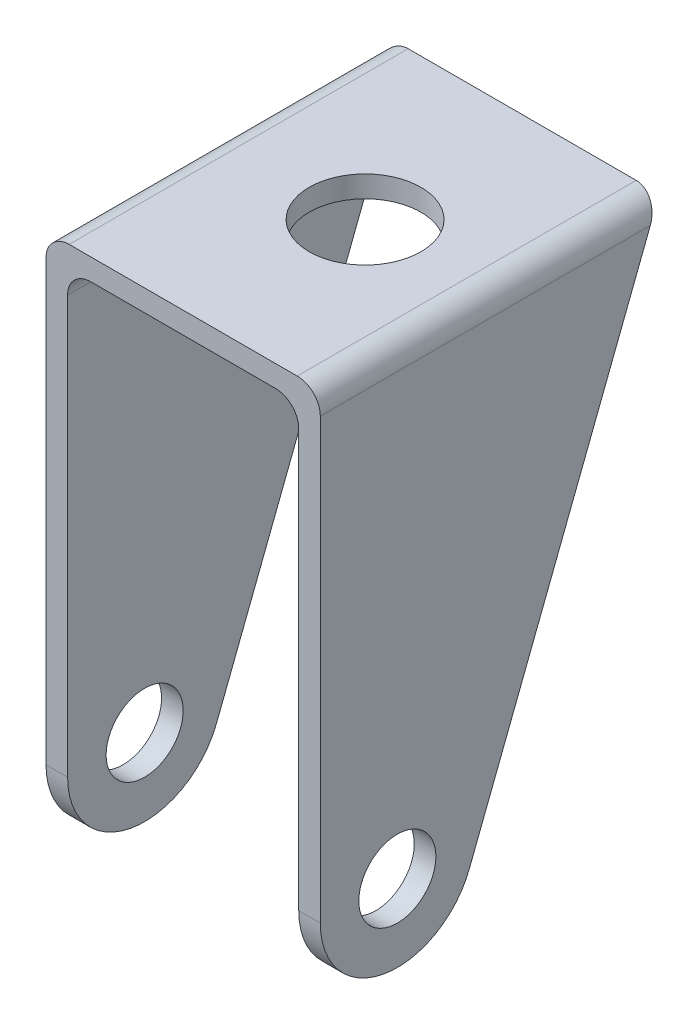
ISO-10303-21;
HEADER;
FILE_DESCRIPTION(('STEP AP214'),'2;1');
FILE_NAME('part.step','',(''),(''),'','','');
FILE_SCHEMA(('AUTOMOTIVE_DESIGN { 1 0 10303 214 1 1 1 1 }'));
ENDSEC;
DATA;
#1=APPLICATION_CONTEXT('core data for automotive mechanical design processes');
#2=APPLICATION_PROTOCOL_DEFINITION('international standard','automotive_design',2000,#1);
#3=PRODUCT_CONTEXT('',#1,'mechanical');
#4=PRODUCT('Part','Part','',(#3));
#5=PRODUCT_RELATED_PRODUCT_CATEGORY('part','',(#4));
#6=PRODUCT_DEFINITION_FORMATION('','',#4);
#7=PRODUCT_DEFINITION_CONTEXT('part definition',#1,'design');
#8=PRODUCT_DEFINITION('design','',#6,#7);
#9=PRODUCT_DEFINITION_SHAPE('','',#8);
#10=(LENGTH_UNIT() NAMED_UNIT(*) SI_UNIT(.MILLI.,.METRE.));
#11=(NAMED_UNIT(*) PLANE_ANGLE_UNIT() SI_UNIT($,.RADIAN.));
#12=(NAMED_UNIT(*) SI_UNIT($,.STERADIAN.) SOLID_ANGLE_UNIT());
#13=UNCERTAINTY_MEASURE_WITH_UNIT(LENGTH_MEASURE(1.E-05),#10,'distance_accuracy_value','');
#14=(GEOMETRIC_REPRESENTATION_CONTEXT(3) GLOBAL_UNCERTAINTY_ASSIGNED_CONTEXT((#13)) GLOBAL_UNIT_ASSIGNED_CONTEXT((#10,
#11,#12)) REPRESENTATION_CONTEXT('',''));
#15=CARTESIAN_POINT('',(0.,0.,0.));
#16=DIRECTION('',(0.,0.,1.));
#17=DIRECTION('',(1.,0.,0.));
#18=AXIS2_PLACEMENT_3D('',#15,#16,#17);
#19=CARTESIAN_POINT('',(30.,70.,44.));
#20=DIRECTION('',(1.,0.,0.));
#21=DIRECTION('',(0.,1.,0.));
#22=AXIS2_PLACEMENT_3D('',#19,#20,#21);
#23=PLANE('',#22);
#24=CARTESIAN_POINT('',(30.,12.8,34.));
#25=DIRECTION('',(1.,0.,0.));
#26=DIRECTION('',(0.,1.,0.));
#27=AXIS2_PLACEMENT_3D('',#24,#25,#26);
#28=CIRCLE('',#27,5.);
#29=CARTESIAN_POINT('',(30.,17.8,34.));
#30=VERTEX_POINT('',#29);
#31=EDGE_CURVE('E173',#30,#30,#28,.T.);
#32=ORIENTED_EDGE('',*,*,#31,.T.);
#33=EDGE_LOOP('',(#32));
#34=FACE_BOUND('',#33,.T.);
#35=DIRECTION('',(0.,-1.,0.));
#36=VECTOR('',#35,1.);
#37=CARTESIAN_POINT('',(30.,70.,44.));
#38=LINE('',#37,#36);
#39=CARTESIAN_POINT('',(30.,67.,44.));
#40=VERTEX_POINT('',#39);
#41=CARTESIAN_POINT('',(30.,12.8,44.));
#42=VERTEX_POINT('',#41);
#43=EDGE_CURVE('E186',#40,#42,#38,.T.);
#44=ORIENTED_EDGE('',*,*,#43,.F.);
#45=DIRECTION('',(0.,0.,-1.));
#46=VECTOR('',#45,1.);
#47=CARTESIAN_POINT('',(30.,67.,1.08612089250458));
#48=LINE('',#47,#46);
#49=CARTESIAN_POINT('',(30.,67.,2.24982184875948));
#50=VERTEX_POINT('',#49);
#51=EDGE_CURVE('E231',#40,#50,#48,.T.);
#52=ORIENTED_EDGE('',*,*,#51,.T.);
#53=DIRECTION('',(0.,0.932315665730798,-0.361645543914119));
#54=VECTOR('',#53,1.);
#55=CARTESIAN_POINT('',(30.,55.530821532966,6.69871983194134));
#56=LINE('',#55,#54);
#57=CARTESIAN_POINT('',(30.,9.18354456085882,24.676843342692));
#58=VERTEX_POINT('',#57);
#59=EDGE_CURVE('E178',#58,#50,#56,.T.);
#60=ORIENTED_EDGE('',*,*,#59,.F.);
#61=CARTESIAN_POINT('',(30.,12.8,34.));
#62=DIRECTION('',(1.,0.,0.));
#63=DIRECTION('',(0.,1.,0.));
#64=AXIS2_PLACEMENT_3D('',#61,#62,#63);
#65=CIRCLE('',#64,9.99999999999999);
#66=EDGE_CURVE('E183',#42,#58,#65,.T.);
#67=ORIENTED_EDGE('',*,*,#66,.F.);
#68=EDGE_LOOP('',(#44,#52,#60,#67));
#69=FACE_BOUND('',#68,.T.);
#70=ADVANCED_FACE('F51',(#34,#69),#23,.F.);
#71=CARTESIAN_POINT('',(32.8,70.,44.));
#72=DIRECTION('',(1.,0.,0.));
#73=DIRECTION('',(0.,1.,0.));
#74=AXIS2_PLACEMENT_3D('',#71,#72,#73);
#75=PLANE('',#74);
#76=CARTESIAN_POINT('',(32.8,12.8,34.));
#77=DIRECTION('',(-1.,0.,0.));
#78=DIRECTION('',(0.,0.,1.));
#79=AXIS2_PLACEMENT_3D('',#76,#77,#78);
#80=CIRCLE('',#79,5.);
#81=CARTESIAN_POINT('',(32.8,12.8,39.));
#82=VERTEX_POINT('',#81);
#83=EDGE_CURVE('E208',#82,#82,#80,.T.);
#84=ORIENTED_EDGE('',*,*,#83,.T.);
#85=EDGE_LOOP('',(#84));
#86=FACE_BOUND('',#85,.T.);
#87=DIRECTION('',(0.,0.932315665730798,-0.361645543914119));
#88=VECTOR('',#87,1.);
#89=CARTESIAN_POINT('',(32.8,9.18354456085882,24.676843342692));
#90=LINE('',#89,#88);
#91=CARTESIAN_POINT('',(32.8,9.18354456085882,24.676843342692));
#92=VERTEX_POINT('',#91);
#93=CARTESIAN_POINT('',(32.8,69.8,1.16370095625491));
#94=VERTEX_POINT('',#93);
#95=EDGE_CURVE('E160',#92,#94,#90,.T.);
#96=ORIENTED_EDGE('',*,*,#95,.T.);
#97=DIRECTION('',(0.,0.,-1.));
#98=VECTOR('',#97,1.);
#99=CARTESIAN_POINT('',(32.8,69.8,44.));
#100=LINE('',#99,#98);
#101=CARTESIAN_POINT('',(32.8,69.8,44.));
#102=VERTEX_POINT('',#101);
#103=EDGE_CURVE('E66',#94,#102,#100,.F.);
#104=ORIENTED_EDGE('',*,*,#103,.T.);
#105=DIRECTION('',(0.,-1.,0.));
#106=VECTOR('',#105,1.);
#107=CARTESIAN_POINT('',(32.8,70.,44.));
#108=LINE('',#107,#106);
#109=CARTESIAN_POINT('',(32.8,12.8,44.));
#110=VERTEX_POINT('',#109);
#111=EDGE_CURVE('E188',#102,#110,#108,.T.);
#112=ORIENTED_EDGE('',*,*,#111,.T.);
#113=CARTESIAN_POINT('',(32.8,12.8,34.));
#114=DIRECTION('',(1.,0.,0.));
#115=DIRECTION('',(0.,-1.,0.));
#116=AXIS2_PLACEMENT_3D('',#113,#114,#115);
#117=CIRCLE('',#116,9.99999999999999);
#118=EDGE_CURVE('E170',#110,#92,#117,.T.);
#119=ORIENTED_EDGE('',*,*,#118,.T.);
#120=EDGE_LOOP('',(#96,#104,#112,#119));
#121=FACE_BOUND('',#120,.T.);
#122=ADVANCED_FACE('F256',(#86,#121),#75,.T.);
#123=CARTESIAN_POINT('',(-2.8,0.,44.));
#124=DIRECTION('',(-1.,0.,0.));
#125=DIRECTION('',(0.,0.,1.));
#126=AXIS2_PLACEMENT_3D('',#123,#124,#125);
#127=PLANE('',#126);
#128=CARTESIAN_POINT('',(-2.8,12.8,34.));
#129=DIRECTION('',(-1.,0.,0.));
#130=DIRECTION('',(0.,0.,1.));
#131=AXIS2_PLACEMENT_3D('',#128,#129,#130);
#132=CIRCLE('',#131,5.);
#133=CARTESIAN_POINT('',(-2.8,12.8,39.));
#134=VERTEX_POINT('',#133);
#135=EDGE_CURVE('E332',#134,#134,#132,.T.);
#136=ORIENTED_EDGE('',*,*,#135,.F.);
#137=EDGE_LOOP('',(#136));
#138=FACE_BOUND('',#137,.T.);
#139=DIRECTION('',(0.,1.,0.));
#140=VECTOR('',#139,1.);
#141=CARTESIAN_POINT('',(-2.8,0.,44.));
#142=LINE('',#141,#140);
#143=CARTESIAN_POINT('',(-2.79999999999999,12.8,44.));
#144=VERTEX_POINT('',#143);
#145=CARTESIAN_POINT('',(-2.8,69.8,44.));
#146=VERTEX_POINT('',#145);
#147=EDGE_CURVE('E193',#144,#146,#142,.T.);
#148=ORIENTED_EDGE('',*,*,#147,.T.);
#149=DIRECTION('',(0.,0.,-1.));
#150=VECTOR('',#149,1.);
#151=CARTESIAN_POINT('',(-2.8,69.8,44.));
#152=LINE('',#151,#150);
#153=CARTESIAN_POINT('',(-2.8,69.8,1.16370095625491));
#154=VERTEX_POINT('',#153);
#155=EDGE_CURVE('E165',#146,#154,#152,.T.);
#156=ORIENTED_EDGE('',*,*,#155,.T.);
#157=DIRECTION('',(0.,0.932315665730798,-0.361645543914119));
#158=VECTOR('',#157,1.);
#159=CARTESIAN_POINT('',(-2.8,9.18354456085882,24.676843342692));
#160=LINE('',#159,#158);
#161=CARTESIAN_POINT('',(-2.8,9.18354456085882,24.676843342692));
#162=VERTEX_POINT('',#161);
#163=EDGE_CURVE('E144',#162,#154,#160,.T.);
#164=ORIENTED_EDGE('',*,*,#163,.F.);
#165=CARTESIAN_POINT('',(-2.8,12.8,34.));
#166=DIRECTION('',(1.,0.,0.));
#167=DIRECTION('',(0.,-1.,0.));
#168=AXIS2_PLACEMENT_3D('',#165,#166,#167);
#169=CIRCLE('',#168,9.99999999999999);
#170=EDGE_CURVE('E153',#144,#162,#169,.T.);
#171=ORIENTED_EDGE('',*,*,#170,.F.);
#172=EDGE_LOOP('',(#148,#156,#164,#171));
#173=FACE_BOUND('',#172,.T.);
#174=ADVANCED_FACE('F163',(#138,#173),#127,.T.);
#175=CARTESIAN_POINT('',(0.,0.,44.));
#176=DIRECTION('',(-1.,0.,0.));
#177=DIRECTION('',(0.,0.,1.));
#178=AXIS2_PLACEMENT_3D('',#175,#176,#177);
#179=PLANE('',#178);
#180=CARTESIAN_POINT('',(0.,12.8,34.));
#181=DIRECTION('',(-1.,0.,0.));
#182=DIRECTION('',(0.,0.,1.));
#183=AXIS2_PLACEMENT_3D('',#180,#181,#182);
#184=CIRCLE('',#183,5.);
#185=CARTESIAN_POINT('',(0.,12.8,39.));
#186=VERTEX_POINT('',#185);
#187=EDGE_CURVE('E205',#186,#186,#184,.T.);
#188=ORIENTED_EDGE('',*,*,#187,.T.);
#189=EDGE_LOOP('',(#188));
#190=FACE_BOUND('',#189,.T.);
#191=DIRECTION('',(0.,-0.932315665730798,0.361645543914119));
#192=VECTOR('',#191,1.);
#193=CARTESIAN_POINT('',(0.,-5.31405350672825,30.3004662542421));
#194=LINE('',#193,#192);
#195=CARTESIAN_POINT('',(0.,67.,2.24982184875947));
#196=VERTEX_POINT('',#195);
#197=CARTESIAN_POINT('',(0.,9.18354456085882,24.676843342692));
#198=VERTEX_POINT('',#197);
#199=EDGE_CURVE('E146',#196,#198,#194,.T.);
#200=ORIENTED_EDGE('',*,*,#199,.F.);
#201=DIRECTION('',(0.,0.,-1.));
#202=VECTOR('',#201,1.);
#203=CARTESIAN_POINT('',(0.,67.,44.));
#204=LINE('',#203,#202);
#205=CARTESIAN_POINT('',(0.,67.,44.));
#206=VERTEX_POINT('',#205);
#207=EDGE_CURVE('E229',#196,#206,#204,.F.);
#208=ORIENTED_EDGE('',*,*,#207,.T.);
#209=DIRECTION('',(0.,1.,0.));
#210=VECTOR('',#209,1.);
#211=CARTESIAN_POINT('',(0.,0.,44.));
#212=LINE('',#211,#210);
#213=CARTESIAN_POINT('',(0.,12.8,44.));
#214=VERTEX_POINT('',#213);
#215=EDGE_CURVE('E195',#214,#206,#212,.T.);
#216=ORIENTED_EDGE('',*,*,#215,.F.);
#217=CARTESIAN_POINT('',(0.,12.8,34.));
#218=DIRECTION('',(-1.,0.,0.));
#219=DIRECTION('',(0.,0.,1.));
#220=AXIS2_PLACEMENT_3D('',#217,#218,#219);
#221=CIRCLE('',#220,9.99999999999999);
#222=EDGE_CURVE('E181',#198,#214,#221,.T.);
#223=ORIENTED_EDGE('',*,*,#222,.F.);
#224=EDGE_LOOP('',(#200,#208,#216,#223));
#225=FACE_BOUND('',#224,.T.);
#226=ADVANCED_FACE('F271',(#190,#225),#179,.F.);
#227=CARTESIAN_POINT('',(0.,70.,44.));
#228=DIRECTION('',(0.,1.,0.));
#229=DIRECTION('',(0.,0.,1.));
#230=AXIS2_PLACEMENT_3D('',#227,#228,#229);
#231=PLANE('',#230);
#232=CARTESIAN_POINT('',(16.61,70.,22.));
#233=DIRECTION('',(0.,1.,0.));
#234=DIRECTION('',(0.,0.,1.));
#235=AXIS2_PLACEMENT_3D('',#232,#233,#234);
#236=CIRCLE('',#235,7.25);
#237=CARTESIAN_POINT('',(16.61,70.,29.25));
#238=VERTEX_POINT('',#237);
#239=EDGE_CURVE('E329',#238,#238,#236,.T.);
#240=ORIENTED_EDGE('',*,*,#239,.T.);
#241=EDGE_LOOP('',(#240));
#242=FACE_BOUND('',#241,.T.);
#243=DIRECTION('',(1.,0.,0.));
#244=VECTOR('',#243,1.);
#245=CARTESIAN_POINT('',(0.,70.,44.));
#246=LINE('',#245,#244);
#247=CARTESIAN_POINT('',(3.,70.,44.));
#248=VERTEX_POINT('',#247);
#249=CARTESIAN_POINT('',(27.,70.,44.));
#250=VERTEX_POINT('',#249);
#251=EDGE_CURVE('E198',#248,#250,#246,.T.);
#252=ORIENTED_EDGE('',*,*,#251,.F.);
#253=DIRECTION('',(0.,0.,-1.));
#254=VECTOR('',#253,1.);
#255=CARTESIAN_POINT('',(3.,70.,1.08612089250458));
#256=LINE('',#255,#254);
#257=CARTESIAN_POINT('',(3.,70.,1.08612089250458));
#258=VERTEX_POINT('',#257);
#259=EDGE_CURVE('E226',#248,#258,#256,.T.);
#260=ORIENTED_EDGE('',*,*,#259,.T.);
#261=DIRECTION('',(-1.,0.,0.));
#262=VECTOR('',#261,1.);
#263=CARTESIAN_POINT('',(0.,70.,1.08612089250458));
#264=LINE('',#263,#262);
#265=CARTESIAN_POINT('',(27.,70.,1.08612089250458));
#266=VERTEX_POINT('',#265);
#267=EDGE_CURVE('E149',#266,#258,#264,.T.);
#268=ORIENTED_EDGE('',*,*,#267,.F.);
#269=DIRECTION('',(0.,0.,-1.));
#270=VECTOR('',#269,1.);
#271=CARTESIAN_POINT('',(27.,70.,44.));
#272=LINE('',#271,#270);
#273=EDGE_CURVE('E224',#266,#250,#272,.F.);
#274=ORIENTED_EDGE('',*,*,#273,.T.);
#275=EDGE_LOOP('',(#252,#260,#268,#274));
#276=FACE_BOUND('',#275,.T.);
#277=ADVANCED_FACE('F245',(#242,#276),#231,.F.);
#278=CARTESIAN_POINT('',(0.,72.8,44.));
#279=DIRECTION('',(0.,1.,0.));
#280=DIRECTION('',(0.,0.,1.));
#281=AXIS2_PLACEMENT_3D('',#278,#279,#280);
#282=PLANE('',#281);
#283=CARTESIAN_POINT('',(16.61,72.8,22.));
#284=DIRECTION('',(0.,1.,0.));
#285=DIRECTION('',(0.,0.,1.));
#286=AXIS2_PLACEMENT_3D('',#283,#284,#285);
#287=CIRCLE('',#286,7.25);
#288=CARTESIAN_POINT('',(16.61,72.8,29.25));
#289=VERTEX_POINT('',#288);
#290=EDGE_CURVE('E328',#289,#289,#287,.T.);
#291=ORIENTED_EDGE('',*,*,#290,.F.);
#292=EDGE_LOOP('',(#291));
#293=FACE_BOUND('',#292,.T.);
#294=DIRECTION('',(1.,0.,0.));
#295=VECTOR('',#294,1.);
#296=CARTESIAN_POINT('',(0.,72.8,0.));
#297=LINE('',#296,#295);
#298=CARTESIAN_POINT('',(0.2,72.8,0.));
#299=VERTEX_POINT('',#298);
#300=CARTESIAN_POINT('',(29.8,72.8,0.));
#301=VERTEX_POINT('',#300);
#302=EDGE_CURVE('E185',#299,#301,#297,.T.);
#303=ORIENTED_EDGE('',*,*,#302,.F.);
#304=DIRECTION('',(0.,0.,-1.));
#305=VECTOR('',#304,1.);
#306=CARTESIAN_POINT('',(0.2,72.8,44.));
#307=LINE('',#306,#305);
#308=CARTESIAN_POINT('',(0.2,72.8,44.));
#309=VERTEX_POINT('',#308);
#310=EDGE_CURVE('E217',#299,#309,#307,.F.);
#311=ORIENTED_EDGE('',*,*,#310,.T.);
#312=DIRECTION('',(1.,0.,0.));
#313=VECTOR('',#312,1.);
#314=CARTESIAN_POINT('',(0.,72.8,44.));
#315=LINE('',#314,#313);
#316=CARTESIAN_POINT('',(29.8,72.8,44.));
#317=VERTEX_POINT('',#316);
#318=EDGE_CURVE('E190',#309,#317,#315,.T.);
#319=ORIENTED_EDGE('',*,*,#318,.T.);
#320=DIRECTION('',(0.,0.,-1.));
#321=VECTOR('',#320,1.);
#322=CARTESIAN_POINT('',(29.8,72.8,44.));
#323=LINE('',#322,#321);
#324=EDGE_CURVE('E214',#317,#301,#323,.T.);
#325=ORIENTED_EDGE('',*,*,#324,.T.);
#326=EDGE_LOOP('',(#303,#311,#319,#325));
#327=FACE_BOUND('',#326,.T.);
#328=ADVANCED_FACE('F263',(#293,#327),#282,.T.);
#329=CARTESIAN_POINT('',(0.,0.,44.));
#330=DIRECTION('',(0.,0.,-1.));
#331=DIRECTION('',(-1.,0.,0.));
#332=AXIS2_PLACEMENT_3D('',#329,#330,#331);
#333=PLANE('',#332);
#334=ORIENTED_EDGE('',*,*,#318,.F.);
#335=CARTESIAN_POINT('',(0.2,69.8,44.));
#336=DIRECTION('',(0.,0.,-1.));
#337=DIRECTION('',(-1.,0.,0.));
#338=AXIS2_PLACEMENT_3D('',#335,#336,#337);
#339=CIRCLE('',#338,3.);
#340=EDGE_CURVE('E221',#309,#146,#339,.F.);
#341=ORIENTED_EDGE('',*,*,#340,.T.);
#342=ORIENTED_EDGE('',*,*,#147,.F.);
#343=DIRECTION('',(1.,0.,0.));
#344=VECTOR('',#343,1.);
#345=CARTESIAN_POINT('',(-2.8,12.8,44.));
#346=LINE('',#345,#344);
#347=EDGE_CURVE('E156',#144,#214,#346,.T.);
#348=ORIENTED_EDGE('',*,*,#347,.T.);
#349=ORIENTED_EDGE('',*,*,#215,.T.);
#350=CARTESIAN_POINT('',(3.,67.,44.));
#351=DIRECTION('',(0.,0.,-1.));
#352=DIRECTION('',(-1.,0.,0.));
#353=AXIS2_PLACEMENT_3D('',#350,#351,#352);
#354=CIRCLE('',#353,3.);
#355=EDGE_CURVE('E236',#206,#248,#354,.T.);
#356=ORIENTED_EDGE('',*,*,#355,.T.);
#357=ORIENTED_EDGE('',*,*,#251,.T.);
#358=CARTESIAN_POINT('',(27.,67.,44.));
#359=DIRECTION('',(0.,0.,-1.));
#360=DIRECTION('',(-1.,0.,0.));
#361=AXIS2_PLACEMENT_3D('',#358,#359,#360);
#362=CIRCLE('',#361,3.);
#363=EDGE_CURVE('E14',#250,#40,#362,.T.);
#364=ORIENTED_EDGE('',*,*,#363,.T.);
#365=ORIENTED_EDGE('',*,*,#43,.T.);
#366=DIRECTION('',(1.,0.,0.));
#367=VECTOR('',#366,1.);
#368=CARTESIAN_POINT('',(-2.8,12.8,44.));
#369=LINE('',#368,#367);
#370=EDGE_CURVE('E200',#42,#110,#369,.T.);
#371=ORIENTED_EDGE('',*,*,#370,.T.);
#372=ORIENTED_EDGE('',*,*,#111,.F.);
#373=CARTESIAN_POINT('',(29.8,69.8,44.));
#374=DIRECTION('',(0.,0.,-1.));
#375=DIRECTION('',(-1.,0.,0.));
#376=AXIS2_PLACEMENT_3D('',#373,#374,#375);
#377=CIRCLE('',#376,3.);
#378=EDGE_CURVE('E219',#102,#317,#377,.F.);
#379=ORIENTED_EDGE('',*,*,#378,.T.);
#380=EDGE_LOOP('',(#334,#341,#342,#348,#349,#356,#357,#364,#365,#371,#372,#379));
#381=FACE_BOUND('',#380,.T.);
#382=ADVANCED_FACE('F251',(#381),#333,.F.);
#383=CARTESIAN_POINT('',(-2.8,12.8,34.));
#384=DIRECTION('',(1.,0.,0.));
#385=DIRECTION('',(0.,1.,0.));
#386=AXIS2_PLACEMENT_3D('',#383,#384,#385);
#387=CYLINDRICAL_SURFACE('',#386,9.99999999999999);
#388=ORIENTED_EDGE('',*,*,#66,.T.);
#389=DIRECTION('',(1.,0.,0.));
#390=VECTOR('',#389,1.);
#391=CARTESIAN_POINT('',(-2.8,9.18354456085882,24.676843342692));
#392=LINE('',#391,#390);
#393=EDGE_CURVE('E150',#58,#92,#392,.T.);
#394=ORIENTED_EDGE('',*,*,#393,.T.);
#395=ORIENTED_EDGE('',*,*,#118,.F.);
#396=ORIENTED_EDGE('',*,*,#370,.F.);
#397=EDGE_LOOP('',(#388,#394,#395,#396));
#398=FACE_BOUND('',#397,.T.);
#399=ADVANCED_FACE('F254',(#398),#387,.T.);
#400=ORIENTED_EDGE('',*,*,#222,.T.);
#401=ORIENTED_EDGE('',*,*,#347,.F.);
#402=ORIENTED_EDGE('',*,*,#170,.T.);
#403=EDGE_CURVE('E140',#162,#198,#392,.T.);
#404=ORIENTED_EDGE('',*,*,#403,.T.);
#405=EDGE_LOOP('',(#400,#401,#402,#404));
#406=FACE_BOUND('',#405,.T.);
#407=ADVANCED_FACE('F154',(#406),#387,.T.);
#408=CARTESIAN_POINT('',(-2.8,9.18354456085882,24.676843342692));
#409=DIRECTION('',(0.,-0.361645543914119,-0.932315665730798));
#410=DIRECTION('',(0.,0.932315665730798,-0.361645543914119));
#411=AXIS2_PLACEMENT_3D('',#408,#409,#410);
#412=PLANE('',#411);
#413=ORIENTED_EDGE('',*,*,#163,.T.);
#414=CARTESIAN_POINT('',(0.2,69.8,1.16370095625491));
#415=DIRECTION('',(0.,-0.361645543914119,-0.932315665730798));
#416=DIRECTION('',(0.,0.932315665730798,-0.361645543914119));
#417=AXIS2_PLACEMENT_3D('',#414,#415,#416);
#418=ELLIPSE('',#417,3.21779426247058,3.);
#419=EDGE_CURVE('E212',#154,#299,#418,.T.);
#420=ORIENTED_EDGE('',*,*,#419,.T.);
#421=ORIENTED_EDGE('',*,*,#302,.T.);
#422=CARTESIAN_POINT('',(29.8,69.8,1.16370095625491));
#423=DIRECTION('',(0.,-0.361645543914119,-0.932315665730798));
#424=DIRECTION('',(0.,0.932315665730798,-0.361645543914119));
#425=AXIS2_PLACEMENT_3D('',#422,#423,#424);
#426=ELLIPSE('',#425,3.21779426247058,3.);
#427=EDGE_CURVE('E210',#301,#94,#426,.T.);
#428=ORIENTED_EDGE('',*,*,#427,.T.);
#429=ORIENTED_EDGE('',*,*,#95,.F.);
#430=ORIENTED_EDGE('',*,*,#393,.F.);
#431=ORIENTED_EDGE('',*,*,#59,.T.);
#432=CARTESIAN_POINT('',(27.,67.,2.24982184875948));
#433=DIRECTION('',(0.,-0.361645543914119,-0.932315665730798));
#434=DIRECTION('',(0.,-0.932315665730798,0.361645543914119));
#435=AXIS2_PLACEMENT_3D('',#432,#433,#434);
#436=ELLIPSE('',#435,3.21779426247058,3.);
#437=EDGE_CURVE('E59',#50,#266,#436,.F.);
#438=ORIENTED_EDGE('',*,*,#437,.T.);
#439=ORIENTED_EDGE('',*,*,#267,.T.);
#440=CARTESIAN_POINT('',(3.,67.,2.24982184875948));
#441=DIRECTION('',(0.,-0.361645543914119,-0.932315665730798));
#442=DIRECTION('',(0.,-0.932315665730798,0.361645543914119));
#443=AXIS2_PLACEMENT_3D('',#440,#441,#442);
#444=ELLIPSE('',#443,3.21779426247058,3.);
#445=EDGE_CURVE('E234',#258,#196,#444,.F.);
#446=ORIENTED_EDGE('',*,*,#445,.T.);
#447=ORIENTED_EDGE('',*,*,#199,.T.);
#448=ORIENTED_EDGE('',*,*,#403,.F.);
#449=EDGE_LOOP('',(#413,#420,#421,#428,#429,#430,#431,#438,#439,#446,#447,#448));
#450=FACE_BOUND('',#449,.T.);
#451=ADVANCED_FACE('F142',(#450),#412,.T.);
#452=CARTESIAN_POINT('',(32.8,12.8,34.));
#453=DIRECTION('',(-1.,0.,0.));
#454=DIRECTION('',(0.,0.,1.));
#455=AXIS2_PLACEMENT_3D('',#452,#453,#454);
#456=CYLINDRICAL_SURFACE('',#455,5.);
#457=ORIENTED_EDGE('',*,*,#135,.T.);
#458=EDGE_LOOP('',(#457));
#459=FACE_BOUND('',#458,.T.);
#460=ORIENTED_EDGE('',*,*,#187,.F.);
#461=EDGE_LOOP('',(#460));
#462=FACE_BOUND('',#461,.T.);
#463=ADVANCED_FACE('F303',(#459,#462),#456,.F.);
#464=ORIENTED_EDGE('',*,*,#83,.F.);
#465=EDGE_LOOP('',(#464));
#466=FACE_BOUND('',#465,.T.);
#467=ORIENTED_EDGE('',*,*,#31,.F.);
#468=EDGE_LOOP('',(#467));
#469=FACE_BOUND('',#468,.T.);
#470=ADVANCED_FACE('F297',(#466,#469),#456,.F.);
#471=CARTESIAN_POINT('',(16.61,62.8,22.));
#472=DIRECTION('',(0.,1.,0.));
#473=DIRECTION('',(0.,0.,1.));
#474=AXIS2_PLACEMENT_3D('',#471,#472,#473);
#475=CYLINDRICAL_SURFACE('',#474,7.25);
#476=ORIENTED_EDGE('',*,*,#290,.T.);
#477=EDGE_LOOP('',(#476));
#478=FACE_BOUND('',#477,.T.);
#479=ORIENTED_EDGE('',*,*,#239,.F.);
#480=EDGE_LOOP('',(#479));
#481=FACE_BOUND('',#480,.T.);
#482=ADVANCED_FACE('F293',(#478,#481),#475,.F.);
#483=CARTESIAN_POINT('',(0.2,69.8,44.));
#484=DIRECTION('',(0.,0.,-1.));
#485=DIRECTION('',(-1.,0.,0.));
#486=AXIS2_PLACEMENT_3D('',#483,#484,#485);
#487=CYLINDRICAL_SURFACE('',#486,3.);
#488=ORIENTED_EDGE('',*,*,#340,.F.);
#489=ORIENTED_EDGE('',*,*,#310,.F.);
#490=ORIENTED_EDGE('',*,*,#419,.F.);
#491=ORIENTED_EDGE('',*,*,#155,.F.);
#492=EDGE_LOOP('',(#488,#489,#490,#491));
#493=FACE_BOUND('',#492,.T.);
#494=ADVANCED_FACE('F267',(#493),#487,.T.);
#495=CARTESIAN_POINT('',(29.8,69.8,44.));
#496=DIRECTION('',(0.,0.,-1.));
#497=DIRECTION('',(-1.,0.,0.));
#498=AXIS2_PLACEMENT_3D('',#495,#496,#497);
#499=CYLINDRICAL_SURFACE('',#498,3.);
#500=ORIENTED_EDGE('',*,*,#378,.F.);
#501=ORIENTED_EDGE('',*,*,#103,.F.);
#502=ORIENTED_EDGE('',*,*,#427,.F.);
#503=ORIENTED_EDGE('',*,*,#324,.F.);
#504=EDGE_LOOP('',(#500,#501,#502,#503));
#505=FACE_BOUND('',#504,.T.);
#506=ADVANCED_FACE('F260',(#505),#499,.T.);
#507=CARTESIAN_POINT('',(3.,67.,44.));
#508=DIRECTION('',(0.,0.,1.));
#509=DIRECTION('',(1.,0.,0.));
#510=AXIS2_PLACEMENT_3D('',#507,#508,#509);
#511=CYLINDRICAL_SURFACE('',#510,3.);
#512=ORIENTED_EDGE('',*,*,#355,.F.);
#513=ORIENTED_EDGE('',*,*,#207,.F.);
#514=ORIENTED_EDGE('',*,*,#445,.F.);
#515=ORIENTED_EDGE('',*,*,#259,.F.);
#516=EDGE_LOOP('',(#512,#513,#514,#515));
#517=FACE_BOUND('',#516,.T.);
#518=ADVANCED_FACE('F274',(#517),#511,.F.);
#519=CARTESIAN_POINT('',(27.,67.,44.));
#520=DIRECTION('',(0.,0.,1.));
#521=DIRECTION('',(1.,0.,0.));
#522=AXIS2_PLACEMENT_3D('',#519,#520,#521);
#523=CYLINDRICAL_SURFACE('',#522,3.);
#524=ORIENTED_EDGE('',*,*,#363,.F.);
#525=ORIENTED_EDGE('',*,*,#273,.F.);
#526=ORIENTED_EDGE('',*,*,#437,.F.);
#527=ORIENTED_EDGE('',*,*,#51,.F.);
#528=EDGE_LOOP('',(#524,#525,#526,#527));
#529=FACE_BOUND('',#528,.T.);
#530=ADVANCED_FACE('F53',(#529),#523,.F.);
#531=CLOSED_SHELL('',(#70,#122,#174,#226,#277,#328,#382,#399,#407,#451,#463,#470,#482,#494,#506,
#518,#530));
#532=MANIFOLD_SOLID_BREP('B2',#531);
#533=ADVANCED_BREP_SHAPE_REPRESENTATION('',(#18,#532),#14);
#534=SHAPE_DEFINITION_REPRESENTATION(#9,#533);
ENDSEC;
END-ISO-10303-21;
